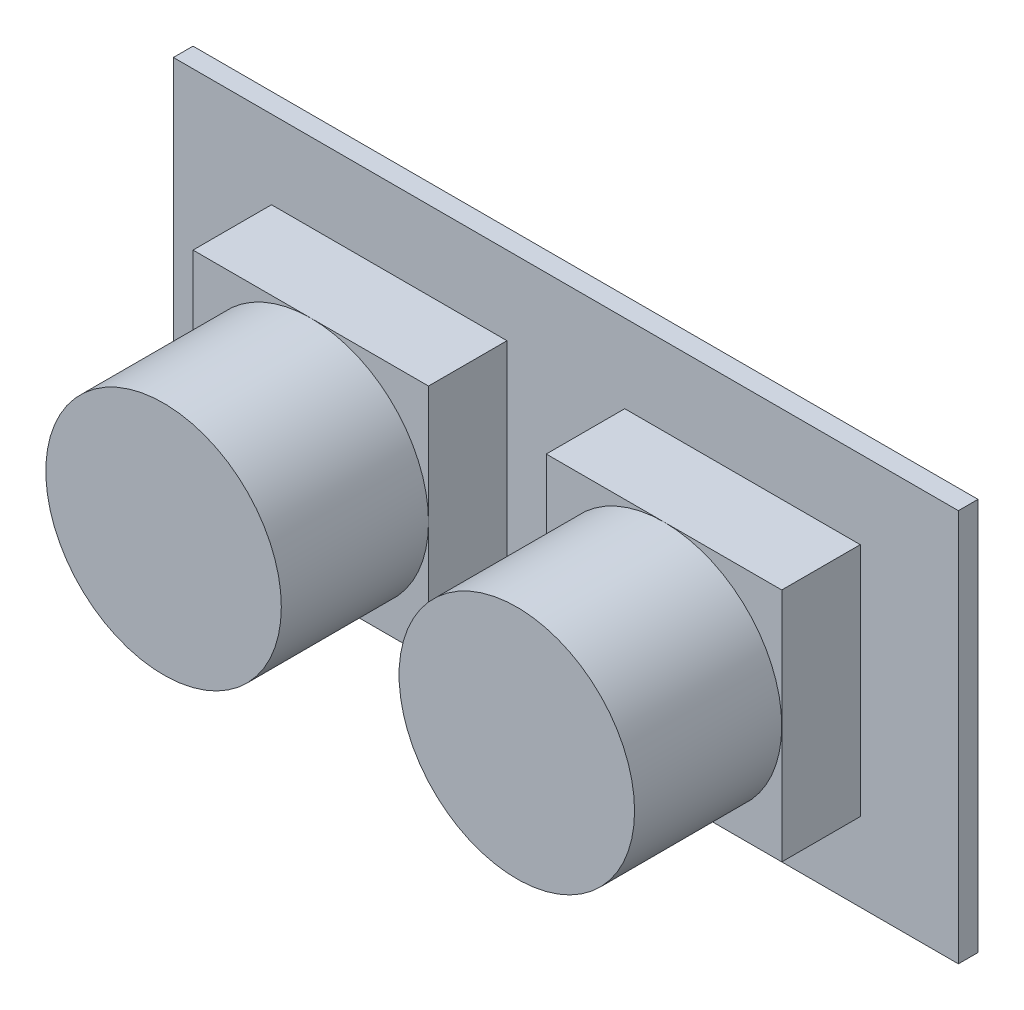
ISO-10303-21;
HEADER;
FILE_DESCRIPTION(('STEP AP214'),'2;1');
FILE_NAME('part.step','',(''),(''),'','','');
FILE_SCHEMA(('AUTOMOTIVE_DESIGN { 1 0 10303 214 1 1 1 1 }'));
ENDSEC;
DATA;
#1=APPLICATION_CONTEXT('core data for automotive mechanical design processes');
#2=APPLICATION_PROTOCOL_DEFINITION('international standard','automotive_design',2000,#1);
#3=PRODUCT_CONTEXT('',#1,'mechanical');
#4=PRODUCT('Part','Part','',(#3));
#5=PRODUCT_RELATED_PRODUCT_CATEGORY('part','',(#4));
#6=PRODUCT_DEFINITION_FORMATION('','',#4);
#7=PRODUCT_DEFINITION_CONTEXT('part definition',#1,'design');
#8=PRODUCT_DEFINITION('design','',#6,#7);
#9=PRODUCT_DEFINITION_SHAPE('','',#8);
#10=(LENGTH_UNIT() NAMED_UNIT(*) SI_UNIT(.MILLI.,.METRE.));
#11=(NAMED_UNIT(*) PLANE_ANGLE_UNIT() SI_UNIT($,.RADIAN.));
#12=(NAMED_UNIT(*) SI_UNIT($,.STERADIAN.) SOLID_ANGLE_UNIT());
#13=UNCERTAINTY_MEASURE_WITH_UNIT(LENGTH_MEASURE(1.E-05),#10,'distance_accuracy_value','');
#14=(GEOMETRIC_REPRESENTATION_CONTEXT(3) GLOBAL_UNCERTAINTY_ASSIGNED_CONTEXT((#13)) GLOBAL_UNIT_ASSIGNED_CONTEXT((#10,
#11,#12)) REPRESENTATION_CONTEXT('',''));
#15=CARTESIAN_POINT('',(0.,0.,0.));
#16=DIRECTION('',(0.,0.,1.));
#17=DIRECTION('',(1.,0.,0.));
#18=AXIS2_PLACEMENT_3D('',#15,#16,#17);
#19=CARTESIAN_POINT('',(0.,0.,0.5));
#20=DIRECTION('',(0.,0.,1.));
#21=DIRECTION('',(1.,0.,0.));
#22=AXIS2_PLACEMENT_3D('',#19,#20,#21);
#23=PLANE('',#22);
#24=DIRECTION('',(0.,1.,0.));
#25=VECTOR('',#24,1.);
#26=CARTESIAN_POINT('',(1.7,0.4,0.5));
#27=LINE('',#26,#25);
#28=CARTESIAN_POINT('',(1.7,0.4,0.5));
#29=VERTEX_POINT('',#28);
#30=CARTESIAN_POINT('',(1.7,1.,0.5));
#31=VERTEX_POINT('',#30);
#32=EDGE_CURVE('E169',#29,#31,#27,.T.);
#33=ORIENTED_EDGE('',*,*,#32,.T.);
#34=CARTESIAN_POINT('',(1.1,1.,0.5));
#35=DIRECTION('',(0.,0.,1.));
#36=DIRECTION('',(1.,0.,0.));
#37=AXIS2_PLACEMENT_3D('',#34,#35,#36);
#38=CIRCLE('',#37,0.6);
#39=CARTESIAN_POINT('',(1.1,0.4,0.5));
#40=VERTEX_POINT('',#39);
#41=EDGE_CURVE('E11',#31,#40,#38,.F.);
#42=ORIENTED_EDGE('',*,*,#41,.T.);
#43=DIRECTION('',(1.,0.,0.));
#44=VECTOR('',#43,1.);
#45=CARTESIAN_POINT('',(1.7,0.4,0.5));
#46=LINE('',#45,#44);
#47=EDGE_CURVE('E178',#40,#29,#46,.T.);
#48=ORIENTED_EDGE('',*,*,#47,.T.);
#49=EDGE_LOOP('',(#33,#42,#48));
#50=FACE_BOUND('',#49,.T.);
#51=ADVANCED_FACE('F36',(#50),#23,.T.);
#52=CARTESIAN_POINT('',(0.5,0.4,0.5));
#53=VERTEX_POINT('',#52);
#54=EDGE_CURVE('E179',#53,#40,#46,.T.);
#55=ORIENTED_EDGE('',*,*,#54,.T.);
#56=CARTESIAN_POINT('',(0.5,1.,0.5));
#57=VERTEX_POINT('',#56);
#58=EDGE_CURVE('E45',#40,#57,#38,.F.);
#59=ORIENTED_EDGE('',*,*,#58,.T.);
#60=DIRECTION('',(0.,-1.,0.));
#61=VECTOR('',#60,1.);
#62=CARTESIAN_POINT('',(0.5,0.4,0.5));
#63=LINE('',#62,#61);
#64=EDGE_CURVE('E173',#57,#53,#63,.T.);
#65=ORIENTED_EDGE('',*,*,#64,.T.);
#66=EDGE_LOOP('',(#55,#59,#65));
#67=FACE_BOUND('',#66,.T.);
#68=ADVANCED_FACE('F317',(#67),#23,.T.);
#69=CARTESIAN_POINT('',(0.5,1.6,0.5));
#70=VERTEX_POINT('',#69);
#71=EDGE_CURVE('E160',#70,#57,#63,.T.);
#72=ORIENTED_EDGE('',*,*,#71,.T.);
#73=CARTESIAN_POINT('',(1.1,1.6,0.5));
#74=VERTEX_POINT('',#73);
#75=EDGE_CURVE('E148',#57,#74,#38,.F.);
#76=ORIENTED_EDGE('',*,*,#75,.T.);
#77=DIRECTION('',(-1.,0.,0.));
#78=VECTOR('',#77,1.);
#79=CARTESIAN_POINT('',(1.7,1.6,0.5));
#80=LINE('',#79,#78);
#81=EDGE_CURVE('E157',#74,#70,#80,.T.);
#82=ORIENTED_EDGE('',*,*,#81,.T.);
#83=EDGE_LOOP('',(#72,#76,#82));
#84=FACE_BOUND('',#83,.T.);
#85=ADVANCED_FACE('F156',(#84),#23,.T.);
#86=CARTESIAN_POINT('',(0.,0.,0.5));
#87=DIRECTION('',(0.,0.,1.));
#88=DIRECTION('',(1.,0.,0.));
#89=AXIS2_PLACEMENT_3D('',#86,#87,#88);
#90=PLANE('',#89);
#91=DIRECTION('',(0.,1.,0.));
#92=VECTOR('',#91,1.);
#93=CARTESIAN_POINT('',(3.5,0.4,0.5));
#94=LINE('',#93,#92);
#95=CARTESIAN_POINT('',(3.5,0.4,0.5));
#96=VERTEX_POINT('',#95);
#97=CARTESIAN_POINT('',(3.5,1.,0.5));
#98=VERTEX_POINT('',#97);
#99=EDGE_CURVE('E200',#96,#98,#94,.T.);
#100=ORIENTED_EDGE('',*,*,#99,.T.);
#101=CARTESIAN_POINT('',(2.9,1.,0.5));
#102=DIRECTION('',(0.,0.,1.));
#103=DIRECTION('',(1.,0.,0.));
#104=AXIS2_PLACEMENT_3D('',#101,#102,#103);
#105=CIRCLE('',#104,0.6);
#106=CARTESIAN_POINT('',(2.9,0.4,0.5));
#107=VERTEX_POINT('',#106);
#108=EDGE_CURVE('E58',#98,#107,#105,.F.);
#109=ORIENTED_EDGE('',*,*,#108,.T.);
#110=DIRECTION('',(1.,0.,0.));
#111=VECTOR('',#110,1.);
#112=CARTESIAN_POINT('',(3.5,0.4,0.5));
#113=LINE('',#112,#111);
#114=EDGE_CURVE('E211',#107,#96,#113,.T.);
#115=ORIENTED_EDGE('',*,*,#114,.T.);
#116=EDGE_LOOP('',(#100,#109,#115));
#117=FACE_BOUND('',#116,.T.);
#118=ADVANCED_FACE('F299',(#117),#90,.T.);
#119=CARTESIAN_POINT('',(2.3,0.4,0.5));
#120=VERTEX_POINT('',#119);
#121=EDGE_CURVE('E212',#120,#107,#113,.T.);
#122=ORIENTED_EDGE('',*,*,#121,.T.);
#123=CARTESIAN_POINT('',(2.3,1.,0.5));
#124=VERTEX_POINT('',#123);
#125=EDGE_CURVE('E269',#107,#124,#105,.F.);
#126=ORIENTED_EDGE('',*,*,#125,.T.);
#127=DIRECTION('',(0.,-1.,0.));
#128=VECTOR('',#127,1.);
#129=CARTESIAN_POINT('',(2.3,0.4,0.5));
#130=LINE('',#129,#128);
#131=EDGE_CURVE('E207',#124,#120,#130,.T.);
#132=ORIENTED_EDGE('',*,*,#131,.T.);
#133=EDGE_LOOP('',(#122,#126,#132));
#134=FACE_BOUND('',#133,.T.);
#135=ADVANCED_FACE('F275',(#134),#90,.T.);
#136=CARTESIAN_POINT('',(2.3,1.6,0.5));
#137=VERTEX_POINT('',#136);
#138=EDGE_CURVE('E208',#137,#124,#130,.T.);
#139=ORIENTED_EDGE('',*,*,#138,.T.);
#140=CARTESIAN_POINT('',(2.9,1.6,0.5));
#141=VERTEX_POINT('',#140);
#142=EDGE_CURVE('E265',#124,#141,#105,.F.);
#143=ORIENTED_EDGE('',*,*,#142,.T.);
#144=DIRECTION('',(-1.,0.,0.));
#145=VECTOR('',#144,1.);
#146=CARTESIAN_POINT('',(3.5,1.6,0.5));
#147=LINE('',#146,#145);
#148=EDGE_CURVE('E203',#141,#137,#147,.T.);
#149=ORIENTED_EDGE('',*,*,#148,.T.);
#150=EDGE_LOOP('',(#139,#143,#149));
#151=FACE_BOUND('',#150,.T.);
#152=ADVANCED_FACE('F282',(#151),#90,.T.);
#153=CARTESIAN_POINT('',(0.,0.,0.1));
#154=DIRECTION('',(0.,0.,-1.));
#155=DIRECTION('',(-1.,0.,0.));
#156=AXIS2_PLACEMENT_3D('',#153,#154,#155);
#157=PLANE('',#156);
#158=DIRECTION('',(0.,1.,0.));
#159=VECTOR('',#158,1.);
#160=CARTESIAN_POINT('',(3.5,0.,0.1));
#161=LINE('',#160,#159);
#162=CARTESIAN_POINT('',(3.5,0.4,0.1));
#163=VERTEX_POINT('',#162);
#164=CARTESIAN_POINT('',(3.5,1.6,0.1));
#165=VERTEX_POINT('',#164);
#166=EDGE_CURVE('E233',#163,#165,#161,.T.);
#167=ORIENTED_EDGE('',*,*,#166,.F.);
#168=DIRECTION('',(1.,0.,0.));
#169=VECTOR('',#168,1.);
#170=CARTESIAN_POINT('',(0.,0.399999999999999,0.1));
#171=LINE('',#170,#169);
#172=CARTESIAN_POINT('',(2.3,0.4,0.1));
#173=VERTEX_POINT('',#172);
#174=EDGE_CURVE('E227',#173,#163,#171,.T.);
#175=ORIENTED_EDGE('',*,*,#174,.F.);
#176=DIRECTION('',(0.,-1.,0.));
#177=VECTOR('',#176,1.);
#178=CARTESIAN_POINT('',(2.3,0.,0.1));
#179=LINE('',#178,#177);
#180=CARTESIAN_POINT('',(2.3,1.6,0.1));
#181=VERTEX_POINT('',#180);
#182=EDGE_CURVE('E229',#181,#173,#179,.T.);
#183=ORIENTED_EDGE('',*,*,#182,.F.);
#184=DIRECTION('',(-1.,0.,0.));
#185=VECTOR('',#184,1.);
#186=CARTESIAN_POINT('',(0.,1.6,0.1));
#187=LINE('',#186,#185);
#188=EDGE_CURVE('E231',#165,#181,#187,.T.);
#189=ORIENTED_EDGE('',*,*,#188,.F.);
#190=EDGE_LOOP('',(#167,#175,#183,#189));
#191=FACE_BOUND('',#190,.T.);
#192=DIRECTION('',(0.,-1.,0.));
#193=VECTOR('',#192,1.);
#194=CARTESIAN_POINT('',(0.,0.,0.1));
#195=LINE('',#194,#193);
#196=CARTESIAN_POINT('',(0.,2.,0.1));
#197=VERTEX_POINT('',#196);
#198=CARTESIAN_POINT('',(0.,0.,0.1));
#199=VERTEX_POINT('',#198);
#200=EDGE_CURVE('E236',#197,#199,#195,.T.);
#201=ORIENTED_EDGE('',*,*,#200,.T.);
#202=DIRECTION('',(1.,0.,0.));
#203=VECTOR('',#202,1.);
#204=CARTESIAN_POINT('',(0.,0.,0.1));
#205=LINE('',#204,#203);
#206=CARTESIAN_POINT('',(4.,0.,0.1));
#207=VERTEX_POINT('',#206);
#208=EDGE_CURVE('E239',#199,#207,#205,.T.);
#209=ORIENTED_EDGE('',*,*,#208,.T.);
#210=DIRECTION('',(0.,1.,0.));
#211=VECTOR('',#210,1.);
#212=CARTESIAN_POINT('',(4.,0.,0.1));
#213=LINE('',#212,#211);
#214=CARTESIAN_POINT('',(4.,2.,0.1));
#215=VERTEX_POINT('',#214);
#216=EDGE_CURVE('E242',#207,#215,#213,.T.);
#217=ORIENTED_EDGE('',*,*,#216,.T.);
#218=DIRECTION('',(-1.,0.,0.));
#219=VECTOR('',#218,1.);
#220=CARTESIAN_POINT('',(0.,2.,0.1));
#221=LINE('',#220,#219);
#222=EDGE_CURVE('E244',#215,#197,#221,.T.);
#223=ORIENTED_EDGE('',*,*,#222,.T.);
#224=EDGE_LOOP('',(#201,#209,#217,#223));
#225=FACE_BOUND('',#224,.T.);
#226=DIRECTION('',(0.,1.,0.));
#227=VECTOR('',#226,1.);
#228=CARTESIAN_POINT('',(1.7,0.,0.1));
#229=LINE('',#228,#227);
#230=CARTESIAN_POINT('',(1.7,0.4,0.1));
#231=VERTEX_POINT('',#230);
#232=CARTESIAN_POINT('',(1.7,1.6,0.1));
#233=VERTEX_POINT('',#232);
#234=EDGE_CURVE('E197',#231,#233,#229,.T.);
#235=ORIENTED_EDGE('',*,*,#234,.F.);
#236=DIRECTION('',(1.,0.,0.));
#237=VECTOR('',#236,1.);
#238=CARTESIAN_POINT('',(0.,0.4,0.1));
#239=LINE('',#238,#237);
#240=CARTESIAN_POINT('',(0.5,0.4,0.1));
#241=VERTEX_POINT('',#240);
#242=EDGE_CURVE('E191',#241,#231,#239,.T.);
#243=ORIENTED_EDGE('',*,*,#242,.F.);
#244=DIRECTION('',(0.,-1.,0.));
#245=VECTOR('',#244,1.);
#246=CARTESIAN_POINT('',(0.5,0.,0.1));
#247=LINE('',#246,#245);
#248=CARTESIAN_POINT('',(0.5,1.6,0.1));
#249=VERTEX_POINT('',#248);
#250=EDGE_CURVE('E193',#249,#241,#247,.T.);
#251=ORIENTED_EDGE('',*,*,#250,.F.);
#252=DIRECTION('',(-1.,0.,0.));
#253=VECTOR('',#252,1.);
#254=CARTESIAN_POINT('',(0.,1.6,0.1));
#255=LINE('',#254,#253);
#256=EDGE_CURVE('E195',#233,#249,#255,.T.);
#257=ORIENTED_EDGE('',*,*,#256,.F.);
#258=EDGE_LOOP('',(#235,#243,#251,#257));
#259=FACE_BOUND('',#258,.T.);
#260=ADVANCED_FACE('F293',(#191,#225,#259),#157,.F.);
#261=CARTESIAN_POINT('',(0.,0.,0.1));
#262=DIRECTION('',(1.,0.,0.));
#263=DIRECTION('',(0.,0.,-1.));
#264=AXIS2_PLACEMENT_3D('',#261,#262,#263);
#265=PLANE('',#264);
#266=DIRECTION('',(0.,-1.,0.));
#267=VECTOR('',#266,1.);
#268=CARTESIAN_POINT('',(0.,0.,0.));
#269=LINE('',#268,#267);
#270=CARTESIAN_POINT('',(0.,2.,0.));
#271=VERTEX_POINT('',#270);
#272=CARTESIAN_POINT('',(0.,0.,0.));
#273=VERTEX_POINT('',#272);
#274=EDGE_CURVE('E235',#271,#273,#269,.T.);
#275=ORIENTED_EDGE('',*,*,#274,.T.);
#276=DIRECTION('',(0.,0.,-1.));
#277=VECTOR('',#276,1.);
#278=CARTESIAN_POINT('',(0.,0.,0.1));
#279=LINE('',#278,#277);
#280=EDGE_CURVE('E262',#199,#273,#279,.T.);
#281=ORIENTED_EDGE('',*,*,#280,.F.);
#282=ORIENTED_EDGE('',*,*,#200,.F.);
#283=DIRECTION('',(0.,0.,-1.));
#284=VECTOR('',#283,1.);
#285=CARTESIAN_POINT('',(0.,2.,0.1));
#286=LINE('',#285,#284);
#287=EDGE_CURVE('E246',#197,#271,#286,.T.);
#288=ORIENTED_EDGE('',*,*,#287,.T.);
#289=EDGE_LOOP('',(#275,#281,#282,#288));
#290=FACE_BOUND('',#289,.T.);
#291=ADVANCED_FACE('F38',(#290),#265,.F.);
#292=CARTESIAN_POINT('',(0.,0.,0.1));
#293=DIRECTION('',(0.,1.,0.));
#294=DIRECTION('',(0.,0.,1.));
#295=AXIS2_PLACEMENT_3D('',#292,#293,#294);
#296=PLANE('',#295);
#297=DIRECTION('',(1.,0.,0.));
#298=VECTOR('',#297,1.);
#299=CARTESIAN_POINT('',(0.,0.,0.));
#300=LINE('',#299,#298);
#301=CARTESIAN_POINT('',(4.,0.,0.));
#302=VERTEX_POINT('',#301);
#303=EDGE_CURVE('E249',#273,#302,#300,.T.);
#304=ORIENTED_EDGE('',*,*,#303,.T.);
#305=DIRECTION('',(0.,0.,-1.));
#306=VECTOR('',#305,1.);
#307=CARTESIAN_POINT('',(4.,0.,0.1));
#308=LINE('',#307,#306);
#309=EDGE_CURVE('E259',#207,#302,#308,.T.);
#310=ORIENTED_EDGE('',*,*,#309,.F.);
#311=ORIENTED_EDGE('',*,*,#208,.F.);
#312=ORIENTED_EDGE('',*,*,#280,.T.);
#313=EDGE_LOOP('',(#304,#310,#311,#312));
#314=FACE_BOUND('',#313,.T.);
#315=ADVANCED_FACE('F368',(#314),#296,.F.);
#316=CARTESIAN_POINT('',(4.,0.,0.1));
#317=DIRECTION('',(-1.,0.,0.));
#318=DIRECTION('',(0.,0.,1.));
#319=AXIS2_PLACEMENT_3D('',#316,#317,#318);
#320=PLANE('',#319);
#321=DIRECTION('',(0.,1.,0.));
#322=VECTOR('',#321,1.);
#323=CARTESIAN_POINT('',(4.,0.,0.));
#324=LINE('',#323,#322);
#325=CARTESIAN_POINT('',(4.,2.,0.));
#326=VERTEX_POINT('',#325);
#327=EDGE_CURVE('E251',#302,#326,#324,.T.);
#328=ORIENTED_EDGE('',*,*,#327,.T.);
#329=DIRECTION('',(0.,0.,-1.));
#330=VECTOR('',#329,1.);
#331=CARTESIAN_POINT('',(4.,2.,0.1));
#332=LINE('',#331,#330);
#333=EDGE_CURVE('E256',#215,#326,#332,.T.);
#334=ORIENTED_EDGE('',*,*,#333,.F.);
#335=ORIENTED_EDGE('',*,*,#216,.F.);
#336=ORIENTED_EDGE('',*,*,#309,.T.);
#337=EDGE_LOOP('',(#328,#334,#335,#336));
#338=FACE_BOUND('',#337,.T.);
#339=ADVANCED_FACE('F375',(#338),#320,.F.);
#340=CARTESIAN_POINT('',(0.,2.,0.1));
#341=DIRECTION('',(0.,-1.,0.));
#342=DIRECTION('',(0.,0.,-1.));
#343=AXIS2_PLACEMENT_3D('',#340,#341,#342);
#344=PLANE('',#343);
#345=DIRECTION('',(-1.,0.,0.));
#346=VECTOR('',#345,1.);
#347=CARTESIAN_POINT('',(0.,2.,0.));
#348=LINE('',#347,#346);
#349=EDGE_CURVE('E240',#326,#271,#348,.T.);
#350=ORIENTED_EDGE('',*,*,#349,.T.);
#351=ORIENTED_EDGE('',*,*,#287,.F.);
#352=ORIENTED_EDGE('',*,*,#222,.F.);
#353=ORIENTED_EDGE('',*,*,#333,.T.);
#354=EDGE_LOOP('',(#350,#351,#352,#353));
#355=FACE_BOUND('',#354,.T.);
#356=ADVANCED_FACE('F382',(#355),#344,.F.);
#357=CARTESIAN_POINT('',(0.,0.,0.));
#358=DIRECTION('',(0.,0.,-1.));
#359=DIRECTION('',(-1.,0.,0.));
#360=AXIS2_PLACEMENT_3D('',#357,#358,#359);
#361=PLANE('',#360);
#362=ORIENTED_EDGE('',*,*,#274,.F.);
#363=ORIENTED_EDGE('',*,*,#349,.F.);
#364=ORIENTED_EDGE('',*,*,#327,.F.);
#365=ORIENTED_EDGE('',*,*,#303,.F.);
#366=EDGE_LOOP('',(#362,#363,#364,#365));
#367=FACE_BOUND('',#366,.T.);
#368=ADVANCED_FACE('F390',(#367),#361,.T.);
#369=CARTESIAN_POINT('',(3.5,0.4,0.5));
#370=DIRECTION('',(-1.,0.,0.));
#371=DIRECTION('',(0.,0.,1.));
#372=AXIS2_PLACEMENT_3D('',#369,#370,#371);
#373=PLANE('',#372);
#374=ORIENTED_EDGE('',*,*,#166,.T.);
#375=DIRECTION('',(0.,0.,-1.));
#376=VECTOR('',#375,1.);
#377=CARTESIAN_POINT('',(3.5,1.6,0.5));
#378=LINE('',#377,#376);
#379=CARTESIAN_POINT('',(3.5,1.6,0.5));
#380=VERTEX_POINT('',#379);
#381=EDGE_CURVE('E224',#380,#165,#378,.T.);
#382=ORIENTED_EDGE('',*,*,#381,.F.);
#383=EDGE_CURVE('E199',#98,#380,#94,.T.);
#384=ORIENTED_EDGE('',*,*,#383,.F.);
#385=ORIENTED_EDGE('',*,*,#99,.F.);
#386=DIRECTION('',(0.,0.,-1.));
#387=VECTOR('',#386,1.);
#388=CARTESIAN_POINT('',(3.5,0.4,0.5));
#389=LINE('',#388,#387);
#390=EDGE_CURVE('E215',#96,#163,#389,.T.);
#391=ORIENTED_EDGE('',*,*,#390,.T.);
#392=EDGE_LOOP('',(#374,#382,#384,#385,#391));
#393=FACE_BOUND('',#392,.T.);
#394=ADVANCED_FACE('F301',(#393),#373,.F.);
#395=CARTESIAN_POINT('',(3.5,1.6,0.5));
#396=DIRECTION('',(0.,-1.,0.));
#397=DIRECTION('',(1.,0.,0.));
#398=AXIS2_PLACEMENT_3D('',#395,#396,#397);
#399=PLANE('',#398);
#400=ORIENTED_EDGE('',*,*,#188,.T.);
#401=DIRECTION('',(0.,0.,-1.));
#402=VECTOR('',#401,1.);
#403=CARTESIAN_POINT('',(2.3,1.6,0.5));
#404=LINE('',#403,#402);
#405=EDGE_CURVE('E221',#137,#181,#404,.T.);
#406=ORIENTED_EDGE('',*,*,#405,.F.);
#407=ORIENTED_EDGE('',*,*,#148,.F.);
#408=EDGE_CURVE('E204',#380,#141,#147,.T.);
#409=ORIENTED_EDGE('',*,*,#408,.F.);
#410=ORIENTED_EDGE('',*,*,#381,.T.);
#411=EDGE_LOOP('',(#400,#406,#407,#409,#410));
#412=FACE_BOUND('',#411,.T.);
#413=ADVANCED_FACE('F287',(#412),#399,.F.);
#414=CARTESIAN_POINT('',(2.3,0.4,0.5));
#415=DIRECTION('',(1.,0.,0.));
#416=DIRECTION('',(0.,0.,-1.));
#417=AXIS2_PLACEMENT_3D('',#414,#415,#416);
#418=PLANE('',#417);
#419=ORIENTED_EDGE('',*,*,#182,.T.);
#420=DIRECTION('',(0.,0.,-1.));
#421=VECTOR('',#420,1.);
#422=CARTESIAN_POINT('',(2.3,0.4,0.5));
#423=LINE('',#422,#421);
#424=EDGE_CURVE('E218',#120,#173,#423,.T.);
#425=ORIENTED_EDGE('',*,*,#424,.F.);
#426=ORIENTED_EDGE('',*,*,#131,.F.);
#427=ORIENTED_EDGE('',*,*,#138,.F.);
#428=ORIENTED_EDGE('',*,*,#405,.T.);
#429=EDGE_LOOP('',(#419,#425,#426,#427,#428));
#430=FACE_BOUND('',#429,.T.);
#431=ADVANCED_FACE('F280',(#430),#418,.F.);
#432=CARTESIAN_POINT('',(3.5,0.4,0.5));
#433=DIRECTION('',(0.,1.,0.));
#434=DIRECTION('',(-1.,0.,0.));
#435=AXIS2_PLACEMENT_3D('',#432,#433,#434);
#436=PLANE('',#435);
#437=ORIENTED_EDGE('',*,*,#174,.T.);
#438=ORIENTED_EDGE('',*,*,#390,.F.);
#439=ORIENTED_EDGE('',*,*,#114,.F.);
#440=ORIENTED_EDGE('',*,*,#121,.F.);
#441=ORIENTED_EDGE('',*,*,#424,.T.);
#442=EDGE_LOOP('',(#437,#438,#439,#440,#441));
#443=FACE_BOUND('',#442,.T.);
#444=ADVANCED_FACE('F297',(#443),#436,.F.);
#445=ORIENTED_EDGE('',*,*,#408,.T.);
#446=EDGE_CURVE('E264',#141,#98,#105,.F.);
#447=ORIENTED_EDGE('',*,*,#446,.T.);
#448=ORIENTED_EDGE('',*,*,#383,.T.);
#449=EDGE_LOOP('',(#445,#447,#448));
#450=FACE_BOUND('',#449,.T.);
#451=ADVANCED_FACE('F303',(#450),#90,.T.);
#452=CARTESIAN_POINT('',(1.7,0.4,0.5));
#453=DIRECTION('',(-1.,0.,0.));
#454=DIRECTION('',(0.,0.,1.));
#455=AXIS2_PLACEMENT_3D('',#452,#453,#454);
#456=PLANE('',#455);
#457=ORIENTED_EDGE('',*,*,#234,.T.);
#458=DIRECTION('',(0.,0.,-1.));
#459=VECTOR('',#458,1.);
#460=CARTESIAN_POINT('',(1.7,1.6,0.5));
#461=LINE('',#460,#459);
#462=CARTESIAN_POINT('',(1.7,1.6,0.5));
#463=VERTEX_POINT('',#462);
#464=EDGE_CURVE('E189',#463,#233,#461,.T.);
#465=ORIENTED_EDGE('',*,*,#464,.F.);
#466=EDGE_CURVE('E172',#31,#463,#27,.T.);
#467=ORIENTED_EDGE('',*,*,#466,.F.);
#468=ORIENTED_EDGE('',*,*,#32,.F.);
#469=DIRECTION('',(0.,0.,-1.));
#470=VECTOR('',#469,1.);
#471=CARTESIAN_POINT('',(1.7,0.4,0.5));
#472=LINE('',#471,#470);
#473=EDGE_CURVE('E182',#29,#231,#472,.T.);
#474=ORIENTED_EDGE('',*,*,#473,.T.);
#475=EDGE_LOOP('',(#457,#465,#467,#468,#474));
#476=FACE_BOUND('',#475,.T.);
#477=ADVANCED_FACE('F305',(#476),#456,.F.);
#478=CARTESIAN_POINT('',(1.7,1.6,0.5));
#479=DIRECTION('',(0.,-1.,0.));
#480=DIRECTION('',(1.,0.,0.));
#481=AXIS2_PLACEMENT_3D('',#478,#479,#480);
#482=PLANE('',#481);
#483=ORIENTED_EDGE('',*,*,#256,.T.);
#484=DIRECTION('',(0.,0.,-1.));
#485=VECTOR('',#484,1.);
#486=CARTESIAN_POINT('',(0.5,1.6,0.5));
#487=LINE('',#486,#485);
#488=EDGE_CURVE('E168',#70,#249,#487,.T.);
#489=ORIENTED_EDGE('',*,*,#488,.F.);
#490=ORIENTED_EDGE('',*,*,#81,.F.);
#491=EDGE_CURVE('E165',#463,#74,#80,.T.);
#492=ORIENTED_EDGE('',*,*,#491,.F.);
#493=ORIENTED_EDGE('',*,*,#464,.T.);
#494=EDGE_LOOP('',(#483,#489,#490,#492,#493));
#495=FACE_BOUND('',#494,.T.);
#496=ADVANCED_FACE('F163',(#495),#482,.F.);
#497=CARTESIAN_POINT('',(0.5,0.4,0.5));
#498=DIRECTION('',(1.,0.,0.));
#499=DIRECTION('',(0.,0.,-1.));
#500=AXIS2_PLACEMENT_3D('',#497,#498,#499);
#501=PLANE('',#500);
#502=ORIENTED_EDGE('',*,*,#250,.T.);
#503=DIRECTION('',(0.,0.,-1.));
#504=VECTOR('',#503,1.);
#505=CARTESIAN_POINT('',(0.5,0.4,0.5));
#506=LINE('',#505,#504);
#507=EDGE_CURVE('E185',#53,#241,#506,.T.);
#508=ORIENTED_EDGE('',*,*,#507,.F.);
#509=ORIENTED_EDGE('',*,*,#64,.F.);
#510=ORIENTED_EDGE('',*,*,#71,.F.);
#511=ORIENTED_EDGE('',*,*,#488,.T.);
#512=EDGE_LOOP('',(#502,#508,#509,#510,#511));
#513=FACE_BOUND('',#512,.T.);
#514=ADVANCED_FACE('F335',(#513),#501,.F.);
#515=CARTESIAN_POINT('',(1.7,0.4,0.5));
#516=DIRECTION('',(0.,1.,0.));
#517=DIRECTION('',(0.,0.,1.));
#518=AXIS2_PLACEMENT_3D('',#515,#516,#517);
#519=PLANE('',#518);
#520=ORIENTED_EDGE('',*,*,#242,.T.);
#521=ORIENTED_EDGE('',*,*,#473,.F.);
#522=ORIENTED_EDGE('',*,*,#47,.F.);
#523=ORIENTED_EDGE('',*,*,#54,.F.);
#524=ORIENTED_EDGE('',*,*,#507,.T.);
#525=EDGE_LOOP('',(#520,#521,#522,#523,#524));
#526=FACE_BOUND('',#525,.T.);
#527=ADVANCED_FACE('F329',(#526),#519,.F.);
#528=ORIENTED_EDGE('',*,*,#491,.T.);
#529=EDGE_CURVE('E40',#74,#31,#38,.F.);
#530=ORIENTED_EDGE('',*,*,#529,.T.);
#531=ORIENTED_EDGE('',*,*,#466,.T.);
#532=EDGE_LOOP('',(#528,#530,#531));
#533=FACE_BOUND('',#532,.T.);
#534=ADVANCED_FACE('F171',(#533),#23,.T.);
#535=CARTESIAN_POINT('',(2.9,1.,1.25));
#536=DIRECTION('',(0.,0.,-1.));
#537=DIRECTION('',(-1.,0.,0.));
#538=AXIS2_PLACEMENT_3D('',#535,#536,#537);
#539=CYLINDRICAL_SURFACE('',#538,0.6);
#540=ORIENTED_EDGE('',*,*,#108,.F.);
#541=ORIENTED_EDGE('',*,*,#446,.F.);
#542=ORIENTED_EDGE('',*,*,#142,.F.);
#543=ORIENTED_EDGE('',*,*,#125,.F.);
#544=EDGE_LOOP('',(#540,#541,#542,#543));
#545=FACE_BOUND('',#544,.T.);
#546=CARTESIAN_POINT('',(2.9,1.,1.25));
#547=DIRECTION('',(0.,0.,1.));
#548=DIRECTION('',(1.,0.,0.));
#549=AXIS2_PLACEMENT_3D('',#546,#547,#548);
#550=CIRCLE('',#549,0.6);
#551=CARTESIAN_POINT('',(3.5,1.,1.25));
#552=VERTEX_POINT('',#551);
#553=EDGE_CURVE('E506',#552,#552,#550,.T.);
#554=ORIENTED_EDGE('',*,*,#553,.F.);
#555=EDGE_LOOP('',(#554));
#556=FACE_BOUND('',#555,.T.);
#557=ADVANCED_FACE('F328',(#545,#556),#539,.T.);
#558=CARTESIAN_POINT('',(2.9,1.,1.25));
#559=DIRECTION('',(0.,0.,1.));
#560=DIRECTION('',(1.,0.,0.));
#561=AXIS2_PLACEMENT_3D('',#558,#559,#560);
#562=PLANE('',#561);
#563=ORIENTED_EDGE('',*,*,#553,.T.);
#564=EDGE_LOOP('',(#563));
#565=FACE_BOUND('',#564,.T.);
#566=ADVANCED_FACE('F334',(#565),#562,.T.);
#567=CARTESIAN_POINT('',(1.1,1.,1.25));
#568=DIRECTION('',(0.,0.,-1.));
#569=DIRECTION('',(-1.,0.,0.));
#570=AXIS2_PLACEMENT_3D('',#567,#568,#569);
#571=CYLINDRICAL_SURFACE('',#570,0.6);
#572=ORIENTED_EDGE('',*,*,#41,.F.);
#573=ORIENTED_EDGE('',*,*,#529,.F.);
#574=ORIENTED_EDGE('',*,*,#75,.F.);
#575=ORIENTED_EDGE('',*,*,#58,.F.);
#576=EDGE_LOOP('',(#572,#573,#574,#575));
#577=FACE_BOUND('',#576,.T.);
#578=CARTESIAN_POINT('',(1.1,1.,1.25));
#579=DIRECTION('',(0.,0.,1.));
#580=DIRECTION('',(1.,0.,0.));
#581=AXIS2_PLACEMENT_3D('',#578,#579,#580);
#582=CIRCLE('',#581,0.6);
#583=CARTESIAN_POINT('',(1.7,1.,1.25));
#584=VERTEX_POINT('',#583);
#585=EDGE_CURVE('E505',#584,#584,#582,.T.);
#586=ORIENTED_EDGE('',*,*,#585,.F.);
#587=EDGE_LOOP('',(#586));
#588=FACE_BOUND('',#587,.T.);
#589=ADVANCED_FACE('F146',(#577,#588),#571,.T.);
#590=CARTESIAN_POINT('',(1.1,1.,1.25));
#591=DIRECTION('',(0.,0.,1.));
#592=DIRECTION('',(1.,0.,0.));
#593=AXIS2_PLACEMENT_3D('',#590,#591,#592);
#594=PLANE('',#593);
#595=ORIENTED_EDGE('',*,*,#585,.T.);
#596=EDGE_LOOP('',(#595));
#597=FACE_BOUND('',#596,.T.);
#598=ADVANCED_FACE('F485',(#597),#594,.T.);
#599=CLOSED_SHELL('',(#51,#68,#85,#118,#135,#152,#260,#291,#315,#339,#356,#368,#394,#413,#431,
#444,#451,#477,#496,#514,#527,#534,#557,#566,#589,#598));
#600=MANIFOLD_SOLID_BREP('B2',#599);
#601=ADVANCED_BREP_SHAPE_REPRESENTATION('',(#18,#600),#14);
#602=SHAPE_DEFINITION_REPRESENTATION(#9,#601);
ENDSEC;
END-ISO-10303-21;
